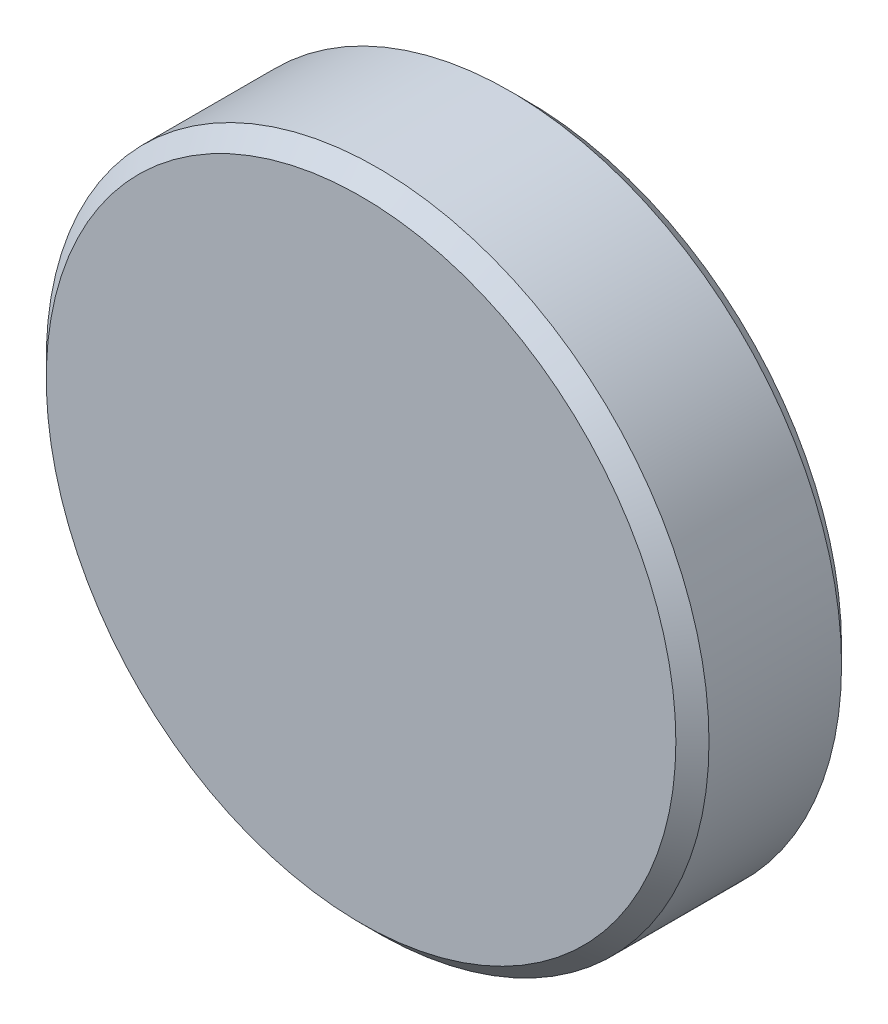
ISO-10303-21;
HEADER;
FILE_DESCRIPTION(('STEP AP214'),'2;1');
FILE_NAME('part.step','',(''),(''),'','','');
FILE_SCHEMA(('AUTOMOTIVE_DESIGN { 1 0 10303 214 1 1 1 1 }'));
ENDSEC;
DATA;
#1=APPLICATION_CONTEXT('core data for automotive mechanical design processes');
#2=APPLICATION_PROTOCOL_DEFINITION('international standard','automotive_design',2000,#1);
#3=PRODUCT_CONTEXT('',#1,'mechanical');
#4=PRODUCT('Part','Part','',(#3));
#5=PRODUCT_RELATED_PRODUCT_CATEGORY('part','',(#4));
#6=PRODUCT_DEFINITION_FORMATION('','',#4);
#7=PRODUCT_DEFINITION_CONTEXT('part definition',#1,'design');
#8=PRODUCT_DEFINITION('design','',#6,#7);
#9=PRODUCT_DEFINITION_SHAPE('','',#8);
#10=(LENGTH_UNIT() NAMED_UNIT(*) SI_UNIT(.MILLI.,.METRE.));
#11=(NAMED_UNIT(*) PLANE_ANGLE_UNIT() SI_UNIT($,.RADIAN.));
#12=(NAMED_UNIT(*) SI_UNIT($,.STERADIAN.) SOLID_ANGLE_UNIT());
#13=UNCERTAINTY_MEASURE_WITH_UNIT(LENGTH_MEASURE(1.E-05),#10,'distance_accuracy_value','');
#14=(GEOMETRIC_REPRESENTATION_CONTEXT(3) GLOBAL_UNCERTAINTY_ASSIGNED_CONTEXT((#13)) GLOBAL_UNIT_ASSIGNED_CONTEXT((#10,
#11,#12)) REPRESENTATION_CONTEXT('',''));
#15=CARTESIAN_POINT('',(0.,0.,0.));
#16=DIRECTION('',(0.,0.,1.));
#17=DIRECTION('',(1.,0.,0.));
#18=AXIS2_PLACEMENT_3D('',#15,#16,#17);
#19=CARTESIAN_POINT('',(0.,0.,2.));
#20=DIRECTION('',(0.,0.,-1.));
#21=DIRECTION('',(-1.,0.,0.));
#22=AXIS2_PLACEMENT_3D('',#19,#20,#21);
#23=CYLINDRICAL_SURFACE('',#22,4.);
#24=CARTESIAN_POINT('',(0.,0.,0.2));
#25=DIRECTION('',(0.,0.,1.));
#26=DIRECTION('',(1.,0.,0.));
#27=AXIS2_PLACEMENT_3D('',#24,#25,#26);
#28=CIRCLE('',#27,4.);
#29=CARTESIAN_POINT('',(4.,0.,0.2));
#30=VERTEX_POINT('',#29);
#31=EDGE_CURVE('E42',#30,#30,#28,.T.);
#32=ORIENTED_EDGE('',*,*,#31,.T.);
#33=EDGE_LOOP('',(#32));
#34=FACE_BOUND('',#33,.T.);
#35=CARTESIAN_POINT('',(0.,0.,1.8));
#36=DIRECTION('',(0.,0.,1.));
#37=DIRECTION('',(1.,0.,0.));
#38=AXIS2_PLACEMENT_3D('',#35,#36,#37);
#39=CIRCLE('',#38,4.);
#40=CARTESIAN_POINT('',(4.,0.,1.8));
#41=VERTEX_POINT('',#40);
#42=EDGE_CURVE('E46',#41,#41,#39,.F.);
#43=ORIENTED_EDGE('',*,*,#42,.T.);
#44=EDGE_LOOP('',(#43));
#45=FACE_BOUND('',#44,.T.);
#46=ADVANCED_FACE('F32',(#34,#45),#23,.T.);
#47=CARTESIAN_POINT('',(0.,0.,2.));
#48=DIRECTION('',(0.,0.,1.));
#49=DIRECTION('',(1.,0.,0.));
#50=AXIS2_PLACEMENT_3D('',#47,#48,#49);
#51=PLANE('',#50);
#52=CARTESIAN_POINT('',(0.,0.,2.));
#53=DIRECTION('',(0.,0.,1.));
#54=DIRECTION('',(1.,0.,0.));
#55=AXIS2_PLACEMENT_3D('',#52,#53,#54);
#56=CIRCLE('',#55,3.8);
#57=CARTESIAN_POINT('',(3.8,0.,2.));
#58=VERTEX_POINT('',#57);
#59=EDGE_CURVE('E10',#58,#58,#56,.T.);
#60=ORIENTED_EDGE('',*,*,#59,.T.);
#61=EDGE_LOOP('',(#60));
#62=FACE_BOUND('',#61,.T.);
#63=ADVANCED_FACE('F65',(#62),#51,.T.);
#64=CARTESIAN_POINT('',(0.,0.,0.));
#65=DIRECTION('',(0.,0.,1.));
#66=DIRECTION('',(1.,0.,0.));
#67=AXIS2_PLACEMENT_3D('',#64,#65,#66);
#68=PLANE('',#67);
#69=CARTESIAN_POINT('',(0.,0.,0.));
#70=DIRECTION('',(0.,0.,1.));
#71=DIRECTION('',(1.,0.,0.));
#72=AXIS2_PLACEMENT_3D('',#69,#70,#71);
#73=CIRCLE('',#72,3.8);
#74=CARTESIAN_POINT('',(3.8,0.,0.));
#75=VERTEX_POINT('',#74);
#76=EDGE_CURVE('E38',#75,#75,#73,.F.);
#77=ORIENTED_EDGE('',*,*,#76,.T.);
#78=EDGE_LOOP('',(#77));
#79=FACE_BOUND('',#78,.T.);
#80=ADVANCED_FACE('F61',(#79),#68,.F.);
#81=CARTESIAN_POINT('',(0.,0.,0.2));
#82=DIRECTION('',(0.,0.,1.));
#83=DIRECTION('',(1.,0.,0.));
#84=AXIS2_PLACEMENT_3D('',#81,#82,#83);
#85=CONICAL_SURFACE('',#84,4.,0.785398163397449);
#86=ORIENTED_EDGE('',*,*,#76,.F.);
#87=EDGE_LOOP('',(#86));
#88=FACE_BOUND('',#87,.T.);
#89=ORIENTED_EDGE('',*,*,#31,.F.);
#90=EDGE_LOOP('',(#89));
#91=FACE_BOUND('',#90,.T.);
#92=ADVANCED_FACE('F56',(#88,#91),#85,.T.);
#93=CARTESIAN_POINT('',(0.,0.,2.));
#94=DIRECTION('',(0.,0.,-1.));
#95=DIRECTION('',(-1.,0.,0.));
#96=AXIS2_PLACEMENT_3D('',#93,#94,#95);
#97=CONICAL_SURFACE('',#96,3.8,0.785398163397445);
#98=ORIENTED_EDGE('',*,*,#42,.F.);
#99=EDGE_LOOP('',(#98));
#100=FACE_BOUND('',#99,.T.);
#101=ORIENTED_EDGE('',*,*,#59,.F.);
#102=EDGE_LOOP('',(#101));
#103=FACE_BOUND('',#102,.T.);
#104=ADVANCED_FACE('F53',(#100,#103),#97,.T.);
#105=CLOSED_SHELL('',(#46,#63,#80,#92,#104));
#106=MANIFOLD_SOLID_BREP('B2',#105);
#107=ADVANCED_BREP_SHAPE_REPRESENTATION('',(#18,#106),#14);
#108=SHAPE_DEFINITION_REPRESENTATION(#9,#107);
ENDSEC;
END-ISO-10303-21;
